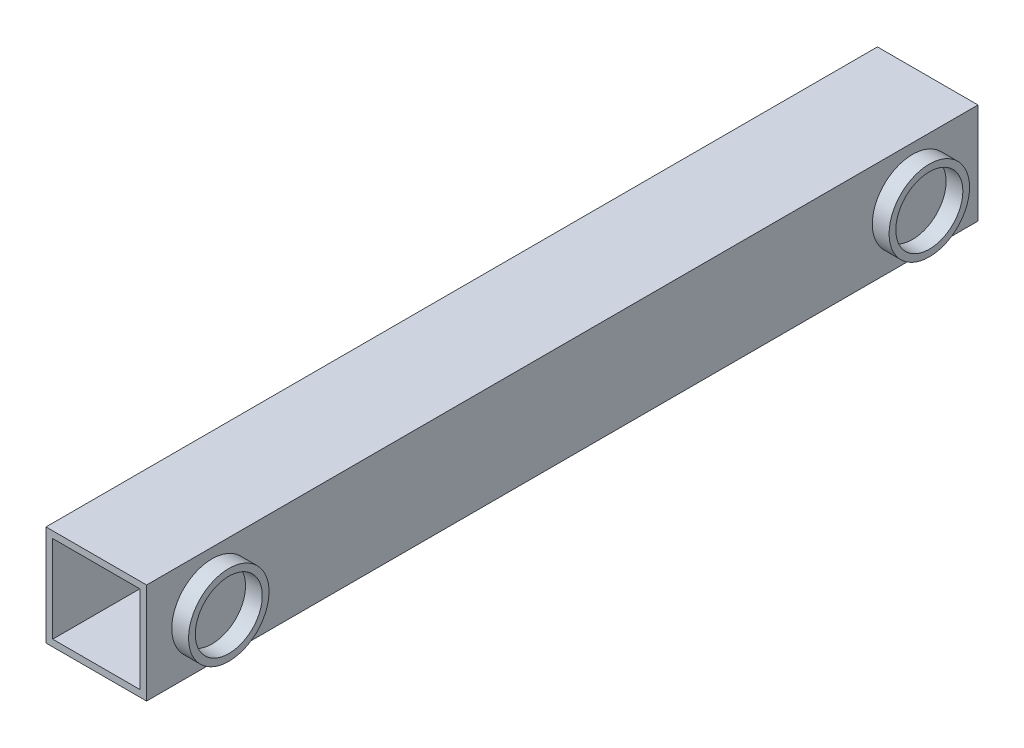
ISO-10303-21;
HEADER;
FILE_DESCRIPTION(('STEP AP214'),'2;1');
FILE_NAME('part.step','',(''),(''),'','','');
FILE_SCHEMA(('AUTOMOTIVE_DESIGN { 1 0 10303 214 1 1 1 1 }'));
ENDSEC;
DATA;
#1=APPLICATION_CONTEXT('core data for automotive mechanical design processes');
#2=APPLICATION_PROTOCOL_DEFINITION('international standard','automotive_design',2000,#1);
#3=PRODUCT_CONTEXT('',#1,'mechanical');
#4=PRODUCT('Part','Part','',(#3));
#5=PRODUCT_RELATED_PRODUCT_CATEGORY('part','',(#4));
#6=PRODUCT_DEFINITION_FORMATION('','',#4);
#7=PRODUCT_DEFINITION_CONTEXT('part definition',#1,'design');
#8=PRODUCT_DEFINITION('design','',#6,#7);
#9=PRODUCT_DEFINITION_SHAPE('','',#8);
#10=(LENGTH_UNIT() NAMED_UNIT(*) SI_UNIT(.MILLI.,.METRE.));
#11=(NAMED_UNIT(*) PLANE_ANGLE_UNIT() SI_UNIT($,.RADIAN.));
#12=(NAMED_UNIT(*) SI_UNIT($,.STERADIAN.) SOLID_ANGLE_UNIT());
#13=UNCERTAINTY_MEASURE_WITH_UNIT(LENGTH_MEASURE(1.E-05),#10,'distance_accuracy_value','');
#14=(GEOMETRIC_REPRESENTATION_CONTEXT(3) GLOBAL_UNCERTAINTY_ASSIGNED_CONTEXT((#13)) GLOBAL_UNIT_ASSIGNED_CONTEXT((#10,
#11,#12)) REPRESENTATION_CONTEXT('',''));
#15=CARTESIAN_POINT('',(0.,0.,0.));
#16=DIRECTION('',(0.,0.,1.));
#17=DIRECTION('',(1.,0.,0.));
#18=AXIS2_PLACEMENT_3D('',#15,#16,#17);
#19=CARTESIAN_POINT('',(0.,0.,248.));
#20=DIRECTION('',(0.,0.,1.));
#21=DIRECTION('',(1.,0.,0.));
#22=AXIS2_PLACEMENT_3D('',#19,#20,#21);
#23=PLANE('',#22);
#24=DIRECTION('',(0.,1.,0.));
#25=VECTOR('',#24,1.);
#26=CARTESIAN_POINT('',(15.,15.,248.));
#27=LINE('',#26,#25);
#28=CARTESIAN_POINT('',(15.,-15.,248.));
#29=VERTEX_POINT('',#28);
#30=CARTESIAN_POINT('',(15.,15.,248.));
#31=VERTEX_POINT('',#30);
#32=EDGE_CURVE('E141',#29,#31,#27,.T.);
#33=ORIENTED_EDGE('',*,*,#32,.T.);
#34=DIRECTION('',(-1.,0.,0.));
#35=VECTOR('',#34,1.);
#36=CARTESIAN_POINT('',(-15.,15.,248.));
#37=LINE('',#36,#35);
#38=CARTESIAN_POINT('',(-15.,15.,248.));
#39=VERTEX_POINT('',#38);
#40=EDGE_CURVE('E144',#31,#39,#37,.T.);
#41=ORIENTED_EDGE('',*,*,#40,.T.);
#42=DIRECTION('',(0.,-1.,0.));
#43=VECTOR('',#42,1.);
#44=CARTESIAN_POINT('',(-15.,15.,248.));
#45=LINE('',#44,#43);
#46=CARTESIAN_POINT('',(-15.,-15.,248.));
#47=VERTEX_POINT('',#46);
#48=EDGE_CURVE('E147',#39,#47,#45,.T.);
#49=ORIENTED_EDGE('',*,*,#48,.T.);
#50=DIRECTION('',(1.,0.,0.));
#51=VECTOR('',#50,1.);
#52=CARTESIAN_POINT('',(-15.,-15.,248.));
#53=LINE('',#52,#51);
#54=EDGE_CURVE('E149',#47,#29,#53,.T.);
#55=ORIENTED_EDGE('',*,*,#54,.T.);
#56=EDGE_LOOP('',(#33,#41,#49,#55));
#57=FACE_BOUND('',#56,.T.);
#58=DIRECTION('',(0.,-1.,0.));
#59=VECTOR('',#58,1.);
#60=CARTESIAN_POINT('',(-13.,13.,248.));
#61=LINE('',#60,#59);
#62=CARTESIAN_POINT('',(-13.,13.,248.));
#63=VERTEX_POINT('',#62);
#64=CARTESIAN_POINT('',(-13.,-13.,248.));
#65=VERTEX_POINT('',#64);
#66=EDGE_CURVE('E111',#63,#65,#61,.T.);
#67=ORIENTED_EDGE('',*,*,#66,.F.);
#68=DIRECTION('',(-1.,0.,0.));
#69=VECTOR('',#68,1.);
#70=CARTESIAN_POINT('',(-13.,13.,248.));
#71=LINE('',#70,#69);
#72=CARTESIAN_POINT('',(13.,13.,248.));
#73=VERTEX_POINT('',#72);
#74=EDGE_CURVE('E103',#73,#63,#71,.T.);
#75=ORIENTED_EDGE('',*,*,#74,.F.);
#76=DIRECTION('',(0.,1.,0.));
#77=VECTOR('',#76,1.);
#78=CARTESIAN_POINT('',(13.,13.,248.));
#79=LINE('',#78,#77);
#80=CARTESIAN_POINT('',(13.,-13.,248.));
#81=VERTEX_POINT('',#80);
#82=EDGE_CURVE('E125',#81,#73,#79,.T.);
#83=ORIENTED_EDGE('',*,*,#82,.F.);
#84=DIRECTION('',(1.,0.,0.));
#85=VECTOR('',#84,1.);
#86=CARTESIAN_POINT('',(-13.,-13.,248.));
#87=LINE('',#86,#85);
#88=EDGE_CURVE('E123',#65,#81,#87,.T.);
#89=ORIENTED_EDGE('',*,*,#88,.F.);
#90=EDGE_LOOP('',(#67,#75,#83,#89));
#91=FACE_BOUND('',#90,.T.);
#92=ADVANCED_FACE('F38',(#57,#91),#23,.T.);
#93=CARTESIAN_POINT('',(0.,0.,0.));
#94=DIRECTION('',(0.,0.,1.));
#95=DIRECTION('',(1.,0.,0.));
#96=AXIS2_PLACEMENT_3D('',#93,#94,#95);
#97=PLANE('',#96);
#98=DIRECTION('',(0.,1.,0.));
#99=VECTOR('',#98,1.);
#100=CARTESIAN_POINT('',(15.,15.,0.));
#101=LINE('',#100,#99);
#102=CARTESIAN_POINT('',(15.,-15.,0.));
#103=VERTEX_POINT('',#102);
#104=CARTESIAN_POINT('',(15.,15.,0.));
#105=VERTEX_POINT('',#104);
#106=EDGE_CURVE('E119',#103,#105,#101,.T.);
#107=ORIENTED_EDGE('',*,*,#106,.F.);
#108=DIRECTION('',(1.,0.,0.));
#109=VECTOR('',#108,1.);
#110=CARTESIAN_POINT('',(-15.,-15.,0.));
#111=LINE('',#110,#109);
#112=CARTESIAN_POINT('',(-15.,-15.,0.));
#113=VERTEX_POINT('',#112);
#114=EDGE_CURVE('E145',#113,#103,#111,.T.);
#115=ORIENTED_EDGE('',*,*,#114,.F.);
#116=DIRECTION('',(0.,-1.,0.));
#117=VECTOR('',#116,1.);
#118=CARTESIAN_POINT('',(-15.,15.,0.));
#119=LINE('',#118,#117);
#120=CARTESIAN_POINT('',(-15.,15.,0.));
#121=VERTEX_POINT('',#120);
#122=EDGE_CURVE('E156',#121,#113,#119,.T.);
#123=ORIENTED_EDGE('',*,*,#122,.F.);
#124=DIRECTION('',(-1.,0.,0.));
#125=VECTOR('',#124,1.);
#126=CARTESIAN_POINT('',(-15.,15.,0.));
#127=LINE('',#126,#125);
#128=EDGE_CURVE('E154',#105,#121,#127,.T.);
#129=ORIENTED_EDGE('',*,*,#128,.F.);
#130=EDGE_LOOP('',(#107,#115,#123,#129));
#131=FACE_BOUND('',#130,.T.);
#132=DIRECTION('',(-1.,0.,0.));
#133=VECTOR('',#132,1.);
#134=CARTESIAN_POINT('',(-13.,13.,0.));
#135=LINE('',#134,#133);
#136=CARTESIAN_POINT('',(13.,13.,0.));
#137=VERTEX_POINT('',#136);
#138=CARTESIAN_POINT('',(-13.,13.,0.));
#139=VERTEX_POINT('',#138);
#140=EDGE_CURVE('E61',#137,#139,#135,.T.);
#141=ORIENTED_EDGE('',*,*,#140,.T.);
#142=DIRECTION('',(0.,-1.,0.));
#143=VECTOR('',#142,1.);
#144=CARTESIAN_POINT('',(-13.,13.,0.));
#145=LINE('',#144,#143);
#146=CARTESIAN_POINT('',(-13.,-13.,0.));
#147=VERTEX_POINT('',#146);
#148=EDGE_CURVE('E118',#139,#147,#145,.T.);
#149=ORIENTED_EDGE('',*,*,#148,.T.);
#150=DIRECTION('',(1.,0.,0.));
#151=VECTOR('',#150,1.);
#152=CARTESIAN_POINT('',(-13.,-13.,0.));
#153=LINE('',#152,#151);
#154=CARTESIAN_POINT('',(13.,-13.,0.));
#155=VERTEX_POINT('',#154);
#156=EDGE_CURVE('E133',#147,#155,#153,.T.);
#157=ORIENTED_EDGE('',*,*,#156,.T.);
#158=DIRECTION('',(0.,1.,0.));
#159=VECTOR('',#158,1.);
#160=CARTESIAN_POINT('',(13.,13.,0.));
#161=LINE('',#160,#159);
#162=EDGE_CURVE('E112',#155,#137,#161,.T.);
#163=ORIENTED_EDGE('',*,*,#162,.T.);
#164=EDGE_LOOP('',(#141,#149,#157,#163));
#165=FACE_BOUND('',#164,.T.);
#166=ADVANCED_FACE('F177',(#131,#165),#97,.F.);
#167=CARTESIAN_POINT('',(15.,15.,248.));
#168=DIRECTION('',(-1.,0.,0.));
#169=DIRECTION('',(0.,0.,1.));
#170=AXIS2_PLACEMENT_3D('',#167,#168,#169);
#171=PLANE('',#170);
#172=CARTESIAN_POINT('',(15.,0.,228.477668762316));
#173=DIRECTION('',(-1.,0.,0.));
#174=DIRECTION('',(0.,0.,1.));
#175=AXIS2_PLACEMENT_3D('',#172,#173,#174);
#176=CIRCLE('',#175,12.);
#177=CARTESIAN_POINT('',(15.,0.,240.477668762316));
#178=VERTEX_POINT('',#177);
#179=EDGE_CURVE('E11',#178,#178,#176,.F.);
#180=ORIENTED_EDGE('',*,*,#179,.F.);
#181=EDGE_LOOP('',(#180));
#182=FACE_BOUND('',#181,.T.);
#183=CARTESIAN_POINT('',(15.,0.,19.5223312376836));
#184=DIRECTION('',(-1.,0.,0.));
#185=DIRECTION('',(0.,0.,1.));
#186=AXIS2_PLACEMENT_3D('',#183,#184,#185);
#187=CIRCLE('',#186,12.);
#188=CARTESIAN_POINT('',(15.,0.,31.5223312376836));
#189=VERTEX_POINT('',#188);
#190=EDGE_CURVE('E46',#189,#189,#187,.F.);
#191=ORIENTED_EDGE('',*,*,#190,.F.);
#192=EDGE_LOOP('',(#191));
#193=FACE_BOUND('',#192,.T.);
#194=ORIENTED_EDGE('',*,*,#106,.T.);
#195=DIRECTION('',(0.,0.,-1.));
#196=VECTOR('',#195,1.);
#197=CARTESIAN_POINT('',(15.,15.,248.));
#198=LINE('',#197,#196);
#199=EDGE_CURVE('E167',#31,#105,#198,.T.);
#200=ORIENTED_EDGE('',*,*,#199,.F.);
#201=ORIENTED_EDGE('',*,*,#32,.F.);
#202=DIRECTION('',(0.,0.,-1.));
#203=VECTOR('',#202,1.);
#204=CARTESIAN_POINT('',(15.,-15.,248.));
#205=LINE('',#204,#203);
#206=EDGE_CURVE('E151',#29,#103,#205,.T.);
#207=ORIENTED_EDGE('',*,*,#206,.T.);
#208=EDGE_LOOP('',(#194,#200,#201,#207));
#209=FACE_BOUND('',#208,.T.);
#210=ADVANCED_FACE('F40',(#182,#193,#209),#171,.F.);
#211=CARTESIAN_POINT('',(-15.,15.,248.));
#212=DIRECTION('',(0.,-1.,0.));
#213=DIRECTION('',(0.,0.,-1.));
#214=AXIS2_PLACEMENT_3D('',#211,#212,#213);
#215=PLANE('',#214);
#216=ORIENTED_EDGE('',*,*,#128,.T.);
#217=DIRECTION('',(0.,0.,-1.));
#218=VECTOR('',#217,1.);
#219=CARTESIAN_POINT('',(-15.,15.,248.));
#220=LINE('',#219,#218);
#221=EDGE_CURVE('E164',#39,#121,#220,.T.);
#222=ORIENTED_EDGE('',*,*,#221,.F.);
#223=ORIENTED_EDGE('',*,*,#40,.F.);
#224=ORIENTED_EDGE('',*,*,#199,.T.);
#225=EDGE_LOOP('',(#216,#222,#223,#224));
#226=FACE_BOUND('',#225,.T.);
#227=ADVANCED_FACE('F176',(#226),#215,.F.);
#228=CARTESIAN_POINT('',(-15.,15.,248.));
#229=DIRECTION('',(1.,0.,0.));
#230=DIRECTION('',(0.,0.,-1.));
#231=AXIS2_PLACEMENT_3D('',#228,#229,#230);
#232=PLANE('',#231);
#233=ORIENTED_EDGE('',*,*,#122,.T.);
#234=DIRECTION('',(0.,0.,-1.));
#235=VECTOR('',#234,1.);
#236=CARTESIAN_POINT('',(-15.,-15.,248.));
#237=LINE('',#236,#235);
#238=EDGE_CURVE('E161',#47,#113,#237,.T.);
#239=ORIENTED_EDGE('',*,*,#238,.F.);
#240=ORIENTED_EDGE('',*,*,#48,.F.);
#241=ORIENTED_EDGE('',*,*,#221,.T.);
#242=EDGE_LOOP('',(#233,#239,#240,#241));
#243=FACE_BOUND('',#242,.T.);
#244=ADVANCED_FACE('F198',(#243),#232,.F.);
#245=CARTESIAN_POINT('',(-15.,-15.,248.));
#246=DIRECTION('',(0.,1.,0.));
#247=DIRECTION('',(0.,0.,1.));
#248=AXIS2_PLACEMENT_3D('',#245,#246,#247);
#249=PLANE('',#248);
#250=ORIENTED_EDGE('',*,*,#114,.T.);
#251=ORIENTED_EDGE('',*,*,#206,.F.);
#252=ORIENTED_EDGE('',*,*,#54,.F.);
#253=ORIENTED_EDGE('',*,*,#238,.T.);
#254=EDGE_LOOP('',(#250,#251,#252,#253));
#255=FACE_BOUND('',#254,.T.);
#256=ADVANCED_FACE('F196',(#255),#249,.F.);
#257=CARTESIAN_POINT('',(-13.,13.,248.));
#258=DIRECTION('',(0.,-1.,0.));
#259=DIRECTION('',(0.,0.,-1.));
#260=AXIS2_PLACEMENT_3D('',#257,#258,#259);
#261=PLANE('',#260);
#262=ORIENTED_EDGE('',*,*,#140,.F.);
#263=DIRECTION('',(0.,0.,-1.));
#264=VECTOR('',#263,1.);
#265=CARTESIAN_POINT('',(13.,13.,248.));
#266=LINE('',#265,#264);
#267=EDGE_CURVE('E107',#73,#137,#266,.T.);
#268=ORIENTED_EDGE('',*,*,#267,.F.);
#269=ORIENTED_EDGE('',*,*,#74,.T.);
#270=DIRECTION('',(0.,0.,-1.));
#271=VECTOR('',#270,1.);
#272=CARTESIAN_POINT('',(-13.,13.,248.));
#273=LINE('',#272,#271);
#274=EDGE_CURVE('E106',#63,#139,#273,.T.);
#275=ORIENTED_EDGE('',*,*,#274,.T.);
#276=EDGE_LOOP('',(#262,#268,#269,#275));
#277=FACE_BOUND('',#276,.T.);
#278=ADVANCED_FACE('F105',(#277),#261,.T.);
#279=CARTESIAN_POINT('',(-13.,13.,248.));
#280=DIRECTION('',(1.,0.,0.));
#281=DIRECTION('',(0.,1.,0.));
#282=AXIS2_PLACEMENT_3D('',#279,#280,#281);
#283=PLANE('',#282);
#284=ORIENTED_EDGE('',*,*,#148,.F.);
#285=ORIENTED_EDGE('',*,*,#274,.F.);
#286=ORIENTED_EDGE('',*,*,#66,.T.);
#287=DIRECTION('',(0.,0.,-1.));
#288=VECTOR('',#287,1.);
#289=CARTESIAN_POINT('',(-13.,-13.,248.));
#290=LINE('',#289,#288);
#291=EDGE_CURVE('E120',#65,#147,#290,.T.);
#292=ORIENTED_EDGE('',*,*,#291,.T.);
#293=EDGE_LOOP('',(#284,#285,#286,#292));
#294=FACE_BOUND('',#293,.T.);
#295=ADVANCED_FACE('F115',(#294),#283,.T.);
#296=CARTESIAN_POINT('',(-13.,-13.,248.));
#297=DIRECTION('',(0.,1.,0.));
#298=DIRECTION('',(-1.,0.,0.));
#299=AXIS2_PLACEMENT_3D('',#296,#297,#298);
#300=PLANE('',#299);
#301=ORIENTED_EDGE('',*,*,#156,.F.);
#302=ORIENTED_EDGE('',*,*,#291,.F.);
#303=ORIENTED_EDGE('',*,*,#88,.T.);
#304=DIRECTION('',(0.,0.,-1.));
#305=VECTOR('',#304,1.);
#306=CARTESIAN_POINT('',(13.,-13.,248.));
#307=LINE('',#306,#305);
#308=EDGE_CURVE('E53',#81,#155,#307,.T.);
#309=ORIENTED_EDGE('',*,*,#308,.T.);
#310=EDGE_LOOP('',(#301,#302,#303,#309));
#311=FACE_BOUND('',#310,.T.);
#312=ADVANCED_FACE('F217',(#311),#300,.T.);
#313=CARTESIAN_POINT('',(13.,13.,248.));
#314=DIRECTION('',(-1.,0.,0.));
#315=DIRECTION('',(0.,-1.,0.));
#316=AXIS2_PLACEMENT_3D('',#313,#314,#315);
#317=PLANE('',#316);
#318=ORIENTED_EDGE('',*,*,#162,.F.);
#319=ORIENTED_EDGE('',*,*,#308,.F.);
#320=ORIENTED_EDGE('',*,*,#82,.T.);
#321=ORIENTED_EDGE('',*,*,#267,.T.);
#322=EDGE_LOOP('',(#318,#319,#320,#321));
#323=FACE_BOUND('',#322,.T.);
#324=ADVANCED_FACE('F220',(#323),#317,.T.);
#325=CARTESIAN_POINT('',(20.,0.,19.5223312376836));
#326=DIRECTION('',(1.,0.,0.));
#327=DIRECTION('',(0.,0.,-1.));
#328=AXIS2_PLACEMENT_3D('',#325,#326,#327);
#329=PLANE('',#328);
#330=CARTESIAN_POINT('',(20.,0.,19.5223312376836));
#331=DIRECTION('',(1.,0.,0.));
#332=DIRECTION('',(0.,0.,-1.));
#333=AXIS2_PLACEMENT_3D('',#330,#331,#332);
#334=CIRCLE('',#333,12.);
#335=CARTESIAN_POINT('',(20.,0.,7.5223312376836));
#336=VERTEX_POINT('',#335);
#337=EDGE_CURVE('E131',#336,#336,#334,.T.);
#338=ORIENTED_EDGE('',*,*,#337,.T.);
#339=EDGE_LOOP('',(#338));
#340=FACE_BOUND('',#339,.T.);
#341=CARTESIAN_POINT('',(20.,0.,19.5223312376836));
#342=DIRECTION('',(1.,0.,0.));
#343=DIRECTION('',(0.,0.,-1.));
#344=AXIS2_PLACEMENT_3D('',#341,#342,#343);
#345=CIRCLE('',#344,10.);
#346=CARTESIAN_POINT('',(20.,0.,9.5223312376836));
#347=VERTEX_POINT('',#346);
#348=EDGE_CURVE('E264',#347,#347,#345,.T.);
#349=ORIENTED_EDGE('',*,*,#348,.F.);
#350=EDGE_LOOP('',(#349));
#351=FACE_BOUND('',#350,.T.);
#352=ADVANCED_FACE('F224',(#340,#351),#329,.T.);
#353=CARTESIAN_POINT('',(20.,0.,19.5223312376836));
#354=DIRECTION('',(-1.,0.,0.));
#355=DIRECTION('',(0.,0.,1.));
#356=AXIS2_PLACEMENT_3D('',#353,#354,#355);
#357=CYLINDRICAL_SURFACE('',#356,12.);
#358=ORIENTED_EDGE('',*,*,#337,.F.);
#359=EDGE_LOOP('',(#358));
#360=FACE_BOUND('',#359,.T.);
#361=ORIENTED_EDGE('',*,*,#190,.T.);
#362=EDGE_LOOP('',(#361));
#363=FACE_BOUND('',#362,.T.);
#364=ADVANCED_FACE('F172',(#360,#363),#357,.T.);
#365=CARTESIAN_POINT('',(20.,0.,19.5223312376836));
#366=DIRECTION('',(-1.,0.,0.));
#367=DIRECTION('',(0.,0.,1.));
#368=AXIS2_PLACEMENT_3D('',#365,#366,#367);
#369=CYLINDRICAL_SURFACE('',#368,10.);
#370=ORIENTED_EDGE('',*,*,#348,.T.);
#371=EDGE_LOOP('',(#370));
#372=FACE_BOUND('',#371,.T.);
#373=CARTESIAN_POINT('',(15.,0.,19.5223312376836));
#374=DIRECTION('',(1.,0.,0.));
#375=DIRECTION('',(0.,0.,-1.));
#376=AXIS2_PLACEMENT_3D('',#373,#374,#375);
#377=CIRCLE('',#376,10.);
#378=CARTESIAN_POINT('',(15.,0.,9.5223312376836));
#379=VERTEX_POINT('',#378);
#380=EDGE_CURVE('E263',#379,#379,#377,.T.);
#381=ORIENTED_EDGE('',*,*,#380,.F.);
#382=EDGE_LOOP('',(#381));
#383=FACE_BOUND('',#382,.T.);
#384=ADVANCED_FACE('F227',(#372,#383),#369,.F.);
#385=ORIENTED_EDGE('',*,*,#380,.T.);
#386=EDGE_LOOP('',(#385));
#387=FACE_BOUND('',#386,.T.);
#388=ADVANCED_FACE('F180',(#387),#171,.F.);
#389=CARTESIAN_POINT('',(20.,0.,228.477668762316));
#390=DIRECTION('',(-1.,0.,0.));
#391=DIRECTION('',(0.,0.,1.));
#392=AXIS2_PLACEMENT_3D('',#389,#390,#391);
#393=PLANE('',#392);
#394=CARTESIAN_POINT('',(20.,0.,228.477668762316));
#395=DIRECTION('',(1.,0.,0.));
#396=DIRECTION('',(0.,0.,1.));
#397=AXIS2_PLACEMENT_3D('',#394,#395,#396);
#398=CIRCLE('',#397,12.);
#399=CARTESIAN_POINT('',(20.,0.,240.477668762316));
#400=VERTEX_POINT('',#399);
#401=EDGE_CURVE('E258',#400,#400,#398,.T.);
#402=ORIENTED_EDGE('',*,*,#401,.T.);
#403=EDGE_LOOP('',(#402));
#404=FACE_BOUND('',#403,.T.);
#405=CARTESIAN_POINT('',(20.,0.,228.477668762316));
#406=DIRECTION('',(1.,0.,0.));
#407=DIRECTION('',(0.,0.,1.));
#408=AXIS2_PLACEMENT_3D('',#405,#406,#407);
#409=CIRCLE('',#408,10.);
#410=CARTESIAN_POINT('',(20.,0.,238.477668762316));
#411=VERTEX_POINT('',#410);
#412=EDGE_CURVE('E253',#411,#411,#409,.T.);
#413=ORIENTED_EDGE('',*,*,#412,.F.);
#414=EDGE_LOOP('',(#413));
#415=FACE_BOUND('',#414,.T.);
#416=ADVANCED_FACE('F239',(#404,#415),#393,.F.);
#417=CARTESIAN_POINT('',(20.,0.,228.477668762316));
#418=DIRECTION('',(-1.,0.,0.));
#419=DIRECTION('',(0.,0.,1.));
#420=AXIS2_PLACEMENT_3D('',#417,#418,#419);
#421=CYLINDRICAL_SURFACE('',#420,12.);
#422=ORIENTED_EDGE('',*,*,#401,.F.);
#423=EDGE_LOOP('',(#422));
#424=FACE_BOUND('',#423,.T.);
#425=ORIENTED_EDGE('',*,*,#179,.T.);
#426=EDGE_LOOP('',(#425));
#427=FACE_BOUND('',#426,.T.);
#428=ADVANCED_FACE('F235',(#424,#427),#421,.T.);
#429=CARTESIAN_POINT('',(20.,0.,228.477668762316));
#430=DIRECTION('',(-1.,0.,0.));
#431=DIRECTION('',(0.,0.,1.));
#432=AXIS2_PLACEMENT_3D('',#429,#430,#431);
#433=CYLINDRICAL_SURFACE('',#432,10.);
#434=ORIENTED_EDGE('',*,*,#412,.T.);
#435=EDGE_LOOP('',(#434));
#436=FACE_BOUND('',#435,.T.);
#437=CARTESIAN_POINT('',(15.,0.,228.477668762316));
#438=DIRECTION('',(1.,0.,0.));
#439=DIRECTION('',(0.,0.,1.));
#440=AXIS2_PLACEMENT_3D('',#437,#438,#439);
#441=CIRCLE('',#440,10.);
#442=CARTESIAN_POINT('',(15.,0.,238.477668762316));
#443=VERTEX_POINT('',#442);
#444=EDGE_CURVE('E256',#443,#443,#441,.T.);
#445=ORIENTED_EDGE('',*,*,#444,.F.);
#446=EDGE_LOOP('',(#445));
#447=FACE_BOUND('',#446,.T.);
#448=ADVANCED_FACE('F238',(#436,#447),#433,.F.);
#449=ORIENTED_EDGE('',*,*,#444,.T.);
#450=EDGE_LOOP('',(#449));
#451=FACE_BOUND('',#450,.T.);
#452=ADVANCED_FACE('F179',(#451),#171,.F.);
#453=CLOSED_SHELL('',(#92,#166,#210,#227,#244,#256,#278,#295,#312,#324,#352,#364,#384,#388,#416,
#428,#448,#452));
#454=MANIFOLD_SOLID_BREP('B2',#453);
#455=ADVANCED_BREP_SHAPE_REPRESENTATION('',(#18,#454),#14);
#456=SHAPE_DEFINITION_REPRESENTATION(#9,#455);
ENDSEC;
END-ISO-10303-21;
